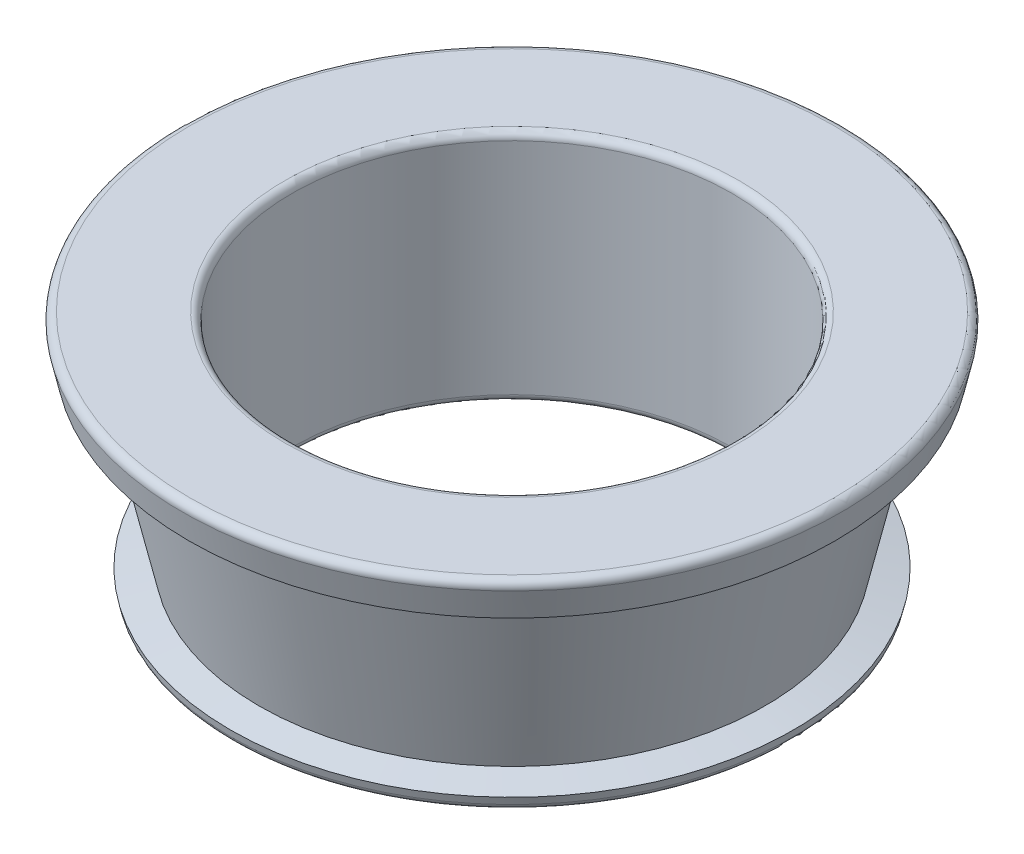
ISO-10303-21;
HEADER;
FILE_DESCRIPTION(('STEP AP214'),'2;1');
FILE_NAME('part.step','',(''),(''),'','','');
FILE_SCHEMA(('AUTOMOTIVE_DESIGN { 1 0 10303 214 1 1 1 1 }'));
ENDSEC;
DATA;
#1=APPLICATION_CONTEXT('core data for automotive mechanical design processes');
#2=APPLICATION_PROTOCOL_DEFINITION('international standard','automotive_design',2000,#1);
#3=PRODUCT_CONTEXT('',#1,'mechanical');
#4=PRODUCT('Part','Part','',(#3));
#5=PRODUCT_RELATED_PRODUCT_CATEGORY('part','',(#4));
#6=PRODUCT_DEFINITION_FORMATION('','',#4);
#7=PRODUCT_DEFINITION_CONTEXT('part definition',#1,'design');
#8=PRODUCT_DEFINITION('design','',#6,#7);
#9=PRODUCT_DEFINITION_SHAPE('','',#8);
#10=(LENGTH_UNIT() NAMED_UNIT(*) SI_UNIT(.MILLI.,.METRE.));
#11=(NAMED_UNIT(*) PLANE_ANGLE_UNIT() SI_UNIT($,.RADIAN.));
#12=(NAMED_UNIT(*) SI_UNIT($,.STERADIAN.) SOLID_ANGLE_UNIT());
#13=UNCERTAINTY_MEASURE_WITH_UNIT(LENGTH_MEASURE(1.E-05),#10,'distance_accuracy_value','');
#14=(GEOMETRIC_REPRESENTATION_CONTEXT(3) GLOBAL_UNCERTAINTY_ASSIGNED_CONTEXT((#13)) GLOBAL_UNIT_ASSIGNED_CONTEXT((#10,
#11,#12)) REPRESENTATION_CONTEXT('',''));
#15=CARTESIAN_POINT('',(0.,0.,0.));
#16=DIRECTION('',(0.,0.,1.));
#17=DIRECTION('',(1.,0.,0.));
#18=AXIS2_PLACEMENT_3D('',#15,#16,#17);
#19=CARTESIAN_POINT('',(15.,13.4810794975304,0.));
#20=DIRECTION('',(0.,-1.,0.));
#21=DIRECTION('',(0.,0.,-1.));
#22=AXIS2_PLACEMENT_3D('',#19,#20,#21);
#23=CONICAL_SURFACE('',#22,22.0332428869443,1.3494818844471);
#24=CARTESIAN_POINT('',(15.,13.9201038877743,0.));
#25=DIRECTION('',(0.,-1.,0.));
#26=DIRECTION('',(0.,0.,-1.));
#27=AXIS2_PLACEMENT_3D('',#24,#25,#26);
#28=CIRCLE('',#27,20.0820233747492);
#29=CARTESIAN_POINT('',(15.,13.9201038877743,-20.0820233747492));
#30=VERTEX_POINT('',#29);
#31=EDGE_CURVE('E10',#30,#30,#28,.T.);
#32=ORIENTED_EDGE('',*,*,#31,.F.);
#33=EDGE_LOOP('',(#32));
#34=FACE_BOUND('',#33,.T.);
#35=CARTESIAN_POINT('',(15.,13.4810794975304,0.));
#36=DIRECTION('',(0.,-1.,0.));
#37=DIRECTION('',(0.,0.,-1.));
#38=AXIS2_PLACEMENT_3D('',#35,#36,#37);
#39=CIRCLE('',#38,22.0332428869443);
#40=CARTESIAN_POINT('',(15.,13.4810794975304,-22.0332428869443));
#41=VERTEX_POINT('',#40);
#42=EDGE_CURVE('E70',#41,#41,#39,.T.);
#43=ORIENTED_EDGE('',*,*,#42,.T.);
#44=EDGE_LOOP('',(#43));
#45=FACE_BOUND('',#44,.T.);
#46=ADVANCED_FACE('F30',(#34,#45),#23,.F.);
#47=CARTESIAN_POINT('',(15.,13.9201038877743,0.));
#48=DIRECTION('',(0.,1.,0.));
#49=DIRECTION('',(0.,0.,1.));
#50=AXIS2_PLACEMENT_3D('',#47,#48,#49);
#51=CONICAL_SURFACE('',#50,20.0820233747492,0.221314442347791);
#52=CARTESIAN_POINT('',(15.,1.33934642728611,0.));
#53=DIRECTION('',(0.,-1.,0.));
#54=DIRECTION('',(0.,0.,-1.));
#55=AXIS2_PLACEMENT_3D('',#52,#53,#54);
#56=CIRCLE('',#55,17.2513529461394);
#57=CARTESIAN_POINT('',(15.,1.33934642728611,-17.2513529461394));
#58=VERTEX_POINT('',#57);
#59=EDGE_CURVE('E36',#58,#58,#56,.T.);
#60=ORIENTED_EDGE('',*,*,#59,.F.);
#61=EDGE_LOOP('',(#60));
#62=FACE_BOUND('',#61,.T.);
#63=ORIENTED_EDGE('',*,*,#31,.T.);
#64=EDGE_LOOP('',(#63));
#65=FACE_BOUND('',#64,.T.);
#66=ADVANCED_FACE('F131',(#62,#65),#51,.T.);
#67=CARTESIAN_POINT('',(15.,1.33934642728611,0.));
#68=DIRECTION('',(0.,-1.,0.));
#69=DIRECTION('',(0.,0.,-1.));
#70=AXIS2_PLACEMENT_3D('',#67,#68,#69);
#71=CONICAL_SURFACE('',#70,17.2513529461394,1.34948188444711);
#72=CARTESIAN_POINT('',(15.,0.900322037042212,0.));
#73=DIRECTION('',(0.,-1.,0.));
#74=DIRECTION('',(0.,0.,-1.));
#75=AXIS2_PLACEMENT_3D('',#72,#73,#74);
#76=CIRCLE('',#75,19.2025724583345);
#77=CARTESIAN_POINT('',(15.,0.900322037042212,-19.2025724583345));
#78=VERTEX_POINT('',#77);
#79=EDGE_CURVE('E40',#78,#78,#76,.T.);
#80=ORIENTED_EDGE('',*,*,#79,.F.);
#81=EDGE_LOOP('',(#80));
#82=FACE_BOUND('',#81,.T.);
#83=ORIENTED_EDGE('',*,*,#59,.T.);
#84=EDGE_LOOP('',(#83));
#85=FACE_BOUND('',#84,.T.);
#86=ADVANCED_FACE('F126',(#82,#85),#71,.T.);
#87=CARTESIAN_POINT('',(15.,0.900322037042212,0.));
#88=DIRECTION('',(0.,1.,0.));
#89=DIRECTION('',(0.,0.,1.));
#90=AXIS2_PLACEMENT_3D('',#87,#88,#89);
#91=CONICAL_SURFACE('',#90,19.2025724583345,0.221314442347792);
#92=CARTESIAN_POINT('',(15.,0.390243902439028,0.));
#93=DIRECTION('',(0.,-1.,0.));
#94=DIRECTION('',(0.,0.,-1.));
#95=AXIS2_PLACEMENT_3D('',#92,#93,#94);
#96=CIRCLE('',#95,19.0878048780488);
#97=CARTESIAN_POINT('',(15.,0.390243902439028,-19.0878048780488));
#98=VERTEX_POINT('',#97);
#99=EDGE_CURVE('E44',#98,#98,#96,.T.);
#100=ORIENTED_EDGE('',*,*,#99,.F.);
#101=EDGE_LOOP('',(#100));
#102=FACE_BOUND('',#101,.T.);
#103=ORIENTED_EDGE('',*,*,#79,.T.);
#104=EDGE_LOOP('',(#103));
#105=FACE_BOUND('',#104,.T.);
#106=ADVANCED_FACE('F120',(#102,#105),#91,.T.);
#107=CARTESIAN_POINT('',(15.,0.5,0.));
#108=DIRECTION('',(0.,-1.,0.));
#109=DIRECTION('',(0.,0.,-1.));
#110=AXIS2_PLACEMENT_3D('',#107,#108,#109);
#111=TOROIDAL_SURFACE('',#110,18.6,0.5);
#112=CARTESIAN_POINT('',(15.,0.,0.));
#113=DIRECTION('',(0.,-1.,0.));
#114=DIRECTION('',(0.,0.,-1.));
#115=AXIS2_PLACEMENT_3D('',#112,#113,#114);
#116=CIRCLE('',#115,18.6);
#117=CARTESIAN_POINT('',(15.,0.,-18.6));
#118=VERTEX_POINT('',#117);
#119=EDGE_CURVE('E49',#118,#118,#116,.T.);
#120=ORIENTED_EDGE('',*,*,#119,.F.);
#121=EDGE_LOOP('',(#120));
#122=FACE_BOUND('',#121,.T.);
#123=ORIENTED_EDGE('',*,*,#99,.T.);
#124=EDGE_LOOP('',(#123));
#125=FACE_BOUND('',#124,.T.);
#126=ADVANCED_FACE('F114',(#122,#125),#111,.T.);
#127=CARTESIAN_POINT('',(-3.6,0.,0.));
#128=DIRECTION('',(0.,1.,0.));
#129=DIRECTION('',(0.,0.,1.));
#130=AXIS2_PLACEMENT_3D('',#127,#128,#129);
#131=PLANE('',#130);
#132=CARTESIAN_POINT('',(15.,0.,0.));
#133=DIRECTION('',(0.,-1.,0.));
#134=DIRECTION('',(0.,0.,-1.));
#135=AXIS2_PLACEMENT_3D('',#132,#133,#134);
#136=CIRCLE('',#135,15.5);
#137=CARTESIAN_POINT('',(15.,0.,-15.5));
#138=VERTEX_POINT('',#137);
#139=EDGE_CURVE('E52',#138,#138,#136,.T.);
#140=ORIENTED_EDGE('',*,*,#139,.F.);
#141=EDGE_LOOP('',(#140));
#142=FACE_BOUND('',#141,.T.);
#143=ORIENTED_EDGE('',*,*,#119,.T.);
#144=EDGE_LOOP('',(#143));
#145=FACE_BOUND('',#144,.T.);
#146=ADVANCED_FACE('F108',(#142,#145),#131,.F.);
#147=CARTESIAN_POINT('',(15.,0.5,0.));
#148=DIRECTION('',(0.,-1.,0.));
#149=DIRECTION('',(0.,0.,-1.));
#150=AXIS2_PLACEMENT_3D('',#147,#148,#149);
#151=TOROIDAL_SURFACE('',#150,15.5,0.5);
#152=CARTESIAN_POINT('',(15.,0.500000000000004,0.));
#153=DIRECTION('',(0.,-1.,0.));
#154=DIRECTION('',(0.,0.,-1.));
#155=AXIS2_PLACEMENT_3D('',#152,#153,#154);
#156=CIRCLE('',#155,15.);
#157=CARTESIAN_POINT('',(15.,0.500000000000004,-15.));
#158=VERTEX_POINT('',#157);
#159=EDGE_CURVE('E55',#158,#158,#156,.T.);
#160=ORIENTED_EDGE('',*,*,#159,.F.);
#161=EDGE_LOOP('',(#160));
#162=FACE_BOUND('',#161,.T.);
#163=ORIENTED_EDGE('',*,*,#139,.T.);
#164=EDGE_LOOP('',(#163));
#165=FACE_BOUND('',#164,.T.);
#166=ADVANCED_FACE('F102',(#162,#165),#151,.T.);
#167=CARTESIAN_POINT('',(15.,1.33934642728611,0.));
#168=DIRECTION('',(0.,-1.,0.));
#169=DIRECTION('',(0.,0.,-1.));
#170=AXIS2_PLACEMENT_3D('',#167,#168,#169);
#171=CYLINDRICAL_SURFACE('',#170,15.);
#172=CARTESIAN_POINT('',(15.,15.5,0.));
#173=DIRECTION('',(0.,-1.,0.));
#174=DIRECTION('',(0.,0.,-1.));
#175=AXIS2_PLACEMENT_3D('',#172,#173,#174);
#176=CIRCLE('',#175,15.);
#177=CARTESIAN_POINT('',(15.,15.5,-15.));
#178=VERTEX_POINT('',#177);
#179=EDGE_CURVE('E58',#178,#178,#176,.T.);
#180=ORIENTED_EDGE('',*,*,#179,.F.);
#181=EDGE_LOOP('',(#180));
#182=FACE_BOUND('',#181,.T.);
#183=ORIENTED_EDGE('',*,*,#159,.T.);
#184=EDGE_LOOP('',(#183));
#185=FACE_BOUND('',#184,.T.);
#186=ADVANCED_FACE('F96',(#182,#185),#171,.F.);
#187=CARTESIAN_POINT('',(15.,15.5,0.));
#188=DIRECTION('',(0.,-1.,0.));
#189=DIRECTION('',(0.,0.,-1.));
#190=AXIS2_PLACEMENT_3D('',#187,#188,#189);
#191=TOROIDAL_SURFACE('',#190,15.5,0.5);
#192=CARTESIAN_POINT('',(15.,16.,0.));
#193=DIRECTION('',(0.,-1.,0.));
#194=DIRECTION('',(0.,0.,-1.));
#195=AXIS2_PLACEMENT_3D('',#192,#193,#194);
#196=CIRCLE('',#195,15.5);
#197=CARTESIAN_POINT('',(15.,16.,-15.5));
#198=VERTEX_POINT('',#197);
#199=EDGE_CURVE('E61',#198,#198,#196,.T.);
#200=ORIENTED_EDGE('',*,*,#199,.F.);
#201=EDGE_LOOP('',(#200));
#202=FACE_BOUND('',#201,.T.);
#203=ORIENTED_EDGE('',*,*,#179,.T.);
#204=EDGE_LOOP('',(#203));
#205=FACE_BOUND('',#204,.T.);
#206=ADVANCED_FACE('F90',(#202,#205),#191,.T.);
#207=CARTESIAN_POINT('',(-0.500000000000004,16.,0.));
#208=DIRECTION('',(0.,-1.,0.));
#209=DIRECTION('',(0.,0.,-1.));
#210=AXIS2_PLACEMENT_3D('',#207,#208,#209);
#211=PLANE('',#210);
#212=CARTESIAN_POINT('',(15.,16.,0.));
#213=DIRECTION('',(0.,-1.,0.));
#214=DIRECTION('',(0.,0.,-1.));
#215=AXIS2_PLACEMENT_3D('',#212,#213,#214);
#216=CIRCLE('',#215,21.975);
#217=CARTESIAN_POINT('',(15.,16.,-21.975));
#218=VERTEX_POINT('',#217);
#219=EDGE_CURVE('E64',#218,#218,#216,.T.);
#220=ORIENTED_EDGE('',*,*,#219,.F.);
#221=EDGE_LOOP('',(#220));
#222=FACE_BOUND('',#221,.T.);
#223=ORIENTED_EDGE('',*,*,#199,.T.);
#224=EDGE_LOOP('',(#223));
#225=FACE_BOUND('',#224,.T.);
#226=ADVANCED_FACE('F84',(#222,#225),#211,.F.);
#227=CARTESIAN_POINT('',(15.,15.5,0.));
#228=DIRECTION('',(0.,-1.,0.));
#229=DIRECTION('',(0.,0.,-1.));
#230=AXIS2_PLACEMENT_3D('',#227,#228,#229);
#231=TOROIDAL_SURFACE('',#230,21.975,0.5);
#232=CARTESIAN_POINT('',(15.,15.390243902439,0.));
#233=DIRECTION('',(0.,-1.,0.));
#234=DIRECTION('',(0.,0.,-1.));
#235=AXIS2_PLACEMENT_3D('',#232,#233,#234);
#236=CIRCLE('',#235,22.4628048780488);
#237=CARTESIAN_POINT('',(15.,15.390243902439,-22.4628048780488));
#238=VERTEX_POINT('',#237);
#239=EDGE_CURVE('E67',#238,#238,#236,.T.);
#240=ORIENTED_EDGE('',*,*,#239,.F.);
#241=EDGE_LOOP('',(#240));
#242=FACE_BOUND('',#241,.T.);
#243=ORIENTED_EDGE('',*,*,#219,.T.);
#244=EDGE_LOOP('',(#243));
#245=FACE_BOUND('',#244,.T.);
#246=ADVANCED_FACE('F78',(#242,#245),#231,.T.);
#247=CARTESIAN_POINT('',(15.,15.390243902439,0.));
#248=DIRECTION('',(0.,1.,0.));
#249=DIRECTION('',(0.,0.,1.));
#250=AXIS2_PLACEMENT_3D('',#247,#248,#249);
#251=CONICAL_SURFACE('',#250,22.4628048780488,0.22131444234779);
#252=ORIENTED_EDGE('',*,*,#42,.F.);
#253=EDGE_LOOP('',(#252));
#254=FACE_BOUND('',#253,.T.);
#255=ORIENTED_EDGE('',*,*,#239,.T.);
#256=EDGE_LOOP('',(#255));
#257=FACE_BOUND('',#256,.T.);
#258=ADVANCED_FACE('F75',(#254,#257),#251,.T.);
#259=CLOSED_SHELL('',(#46,#66,#86,#106,#126,#146,#166,#186,#206,#226,#246,#258));
#260=MANIFOLD_SOLID_BREP('B2',#259);
#261=ADVANCED_BREP_SHAPE_REPRESENTATION('',(#18,#260),#14);
#262=SHAPE_DEFINITION_REPRESENTATION(#9,#261);
ENDSEC;
END-ISO-10303-21;
